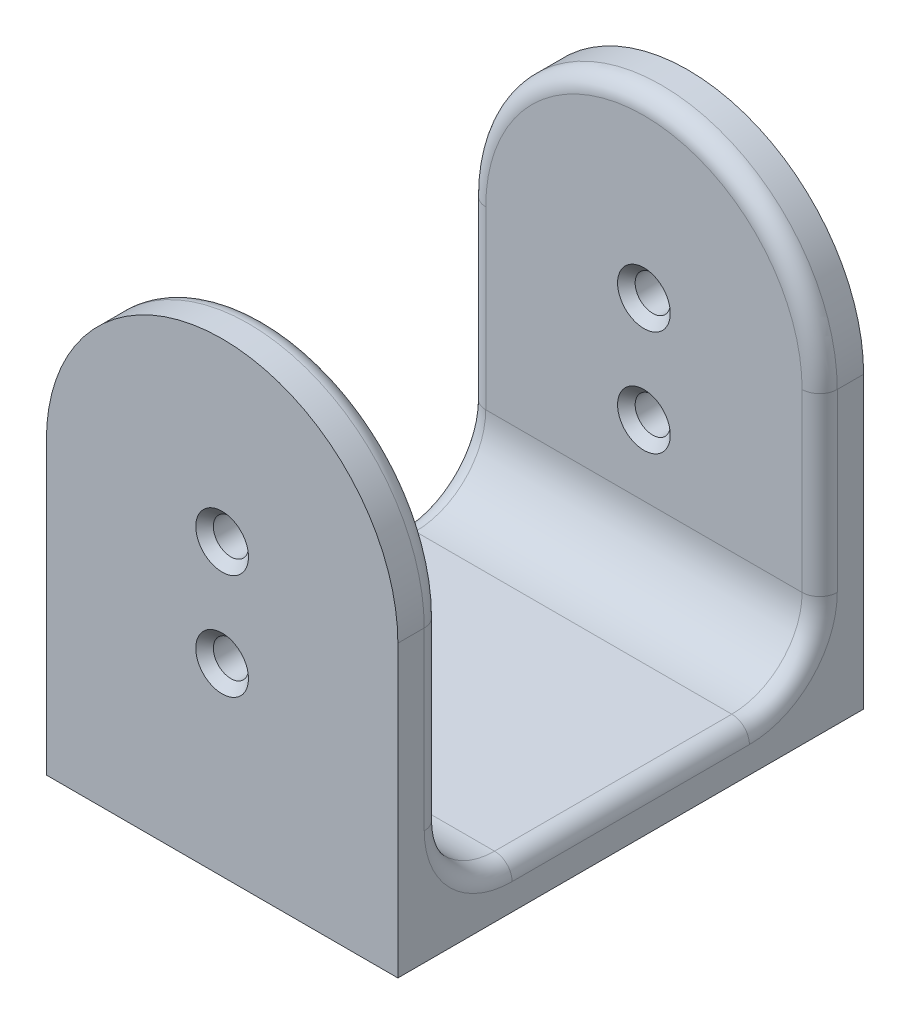
ISO-10303-21;
HEADER;
FILE_DESCRIPTION(('STEP AP214'),'2;1');
FILE_NAME('part.step','',(''),(''),'','','');
FILE_SCHEMA(('AUTOMOTIVE_DESIGN { 1 0 10303 214 1 1 1 1 }'));
ENDSEC;
DATA;
#1=APPLICATION_CONTEXT('core data for automotive mechanical design processes');
#2=APPLICATION_PROTOCOL_DEFINITION('international standard','automotive_design',2000,#1);
#3=PRODUCT_CONTEXT('',#1,'mechanical');
#4=PRODUCT('Part','Part','',(#3));
#5=PRODUCT_RELATED_PRODUCT_CATEGORY('part','',(#4));
#6=PRODUCT_DEFINITION_FORMATION('','',#4);
#7=PRODUCT_DEFINITION_CONTEXT('part definition',#1,'design');
#8=PRODUCT_DEFINITION('design','',#6,#7);
#9=PRODUCT_DEFINITION_SHAPE('','',#8);
#10=(LENGTH_UNIT() NAMED_UNIT(*) SI_UNIT(.MILLI.,.METRE.));
#11=(NAMED_UNIT(*) PLANE_ANGLE_UNIT() SI_UNIT($,.RADIAN.));
#12=(NAMED_UNIT(*) SI_UNIT($,.STERADIAN.) SOLID_ANGLE_UNIT());
#13=UNCERTAINTY_MEASURE_WITH_UNIT(LENGTH_MEASURE(1.E-05),#10,'distance_accuracy_value','');
#14=(GEOMETRIC_REPRESENTATION_CONTEXT(3) GLOBAL_UNCERTAINTY_ASSIGNED_CONTEXT((#13)) GLOBAL_UNIT_ASSIGNED_CONTEXT((#10,
#11,#12)) REPRESENTATION_CONTEXT('',''));
#15=CARTESIAN_POINT('',(0.,0.,0.));
#16=DIRECTION('',(0.,0.,1.));
#17=DIRECTION('',(1.,0.,0.));
#18=AXIS2_PLACEMENT_3D('',#15,#16,#17);
#19=CARTESIAN_POINT('',(0.,5.,-50.5));
#20=DIRECTION('',(0.,-1.,0.));
#21=DIRECTION('',(1.,0.,0.));
#22=AXIS2_PLACEMENT_3D('',#19,#20,#21);
#23=PLANE('',#22);
#24=DIRECTION('',(-1.,0.,0.));
#25=VECTOR('',#24,1.);
#26=CARTESIAN_POINT('',(-20.,5.,-37.5));
#27=LINE('',#26,#25);
#28=CARTESIAN_POINT('',(18.,5.,-37.5));
#29=VERTEX_POINT('',#28);
#30=CARTESIAN_POINT('',(-18.,5.,-37.5));
#31=VERTEX_POINT('',#30);
#32=EDGE_CURVE('E233',#29,#31,#27,.T.);
#33=ORIENTED_EDGE('',*,*,#32,.T.);
#34=DIRECTION('',(0.,0.,1.));
#35=VECTOR('',#34,1.);
#36=CARTESIAN_POINT('',(-18.,5.,-50.5));
#37=LINE('',#36,#35);
#38=CARTESIAN_POINT('',(-18.,5.,-10.5));
#39=VERTEX_POINT('',#38);
#40=EDGE_CURVE('E312',#31,#39,#37,.T.);
#41=ORIENTED_EDGE('',*,*,#40,.T.);
#42=DIRECTION('',(-1.,0.,0.));
#43=VECTOR('',#42,1.);
#44=CARTESIAN_POINT('',(0.,5.,-10.5));
#45=LINE('',#44,#43);
#46=CARTESIAN_POINT('',(18.,5.,-10.5));
#47=VERTEX_POINT('',#46);
#48=EDGE_CURVE('E229',#39,#47,#45,.F.);
#49=ORIENTED_EDGE('',*,*,#48,.T.);
#50=DIRECTION('',(0.,0.,1.));
#51=VECTOR('',#50,1.);
#52=CARTESIAN_POINT('',(18.,5.,-50.5));
#53=LINE('',#52,#51);
#54=EDGE_CURVE('E309',#47,#29,#53,.F.);
#55=ORIENTED_EDGE('',*,*,#54,.T.);
#56=EDGE_LOOP('',(#33,#41,#49,#55));
#57=FACE_BOUND('',#56,.T.);
#58=ADVANCED_FACE('F45',(#57),#23,.F.);
#59=CARTESIAN_POINT('',(0.,33.,-2.5));
#60=DIRECTION('',(0.,0.,-1.));
#61=DIRECTION('',(-1.,0.,0.));
#62=AXIS2_PLACEMENT_3D('',#59,#60,#61);
#63=PLANE('',#62);
#64=CARTESIAN_POINT('',(0.,21.,-2.5));
#65=DIRECTION('',(0.,0.,-1.));
#66=DIRECTION('',(-1.,0.,0.));
#67=AXIS2_PLACEMENT_3D('',#64,#65,#66);
#68=CIRCLE('',#67,3.00000000000001);
#69=CARTESIAN_POINT('',(-3.00000000000001,21.,-2.5));
#70=VERTEX_POINT('',#69);
#71=EDGE_CURVE('E360',#70,#70,#68,.F.);
#72=ORIENTED_EDGE('',*,*,#71,.T.);
#73=EDGE_LOOP('',(#72));
#74=FACE_BOUND('',#73,.T.);
#75=CARTESIAN_POINT('',(0.,33.,-2.5));
#76=DIRECTION('',(0.,0.,-1.));
#77=DIRECTION('',(-1.,0.,0.));
#78=AXIS2_PLACEMENT_3D('',#75,#76,#77);
#79=CIRCLE('',#78,3.00000000000001);
#80=CARTESIAN_POINT('',(-3.00000000000001,33.,-2.5));
#81=VERTEX_POINT('',#80);
#82=EDGE_CURVE('E315',#81,#81,#79,.F.);
#83=ORIENTED_EDGE('',*,*,#82,.T.);
#84=EDGE_LOOP('',(#83));
#85=FACE_BOUND('',#84,.T.);
#86=CARTESIAN_POINT('',(0.,33.,-2.5));
#87=DIRECTION('',(0.,0.,-1.));
#88=DIRECTION('',(-1.,0.,0.));
#89=AXIS2_PLACEMENT_3D('',#86,#87,#88);
#90=CIRCLE('',#89,18.);
#91=CARTESIAN_POINT('',(-18.,33.,-2.5));
#92=VERTEX_POINT('',#91);
#93=CARTESIAN_POINT('',(18.,33.,-2.5));
#94=VERTEX_POINT('',#93);
#95=EDGE_CURVE('E62',#92,#94,#90,.T.);
#96=ORIENTED_EDGE('',*,*,#95,.T.);
#97=DIRECTION('',(0.,1.,0.));
#98=VECTOR('',#97,1.);
#99=CARTESIAN_POINT('',(18.,13.,-2.5));
#100=LINE('',#99,#98);
#101=CARTESIAN_POINT('',(18.,13.,-2.5));
#102=VERTEX_POINT('',#101);
#103=EDGE_CURVE('E304',#94,#102,#100,.F.);
#104=ORIENTED_EDGE('',*,*,#103,.T.);
#105=DIRECTION('',(-1.,0.,0.));
#106=VECTOR('',#105,1.);
#107=CARTESIAN_POINT('',(0.,13.,-2.5));
#108=LINE('',#107,#106);
#109=CARTESIAN_POINT('',(-18.,13.,-2.5));
#110=VERTEX_POINT('',#109);
#111=EDGE_CURVE('E241',#102,#110,#108,.T.);
#112=ORIENTED_EDGE('',*,*,#111,.T.);
#113=DIRECTION('',(0.,-1.,0.));
#114=VECTOR('',#113,1.);
#115=CARTESIAN_POINT('',(-18.,33.,-2.5));
#116=LINE('',#115,#114);
#117=EDGE_CURVE('E67',#110,#92,#116,.F.);
#118=ORIENTED_EDGE('',*,*,#117,.T.);
#119=EDGE_LOOP('',(#96,#104,#112,#118));
#120=FACE_BOUND('',#119,.T.);
#121=ADVANCED_FACE('F476',(#74,#85,#120),#63,.T.);
#122=CARTESIAN_POINT('',(0.,33.,2.5));
#123=DIRECTION('',(0.,0.,-1.));
#124=DIRECTION('',(-1.,0.,0.));
#125=AXIS2_PLACEMENT_3D('',#122,#123,#124);
#126=PLANE('',#125);
#127=CARTESIAN_POINT('',(0.,21.,2.5));
#128=DIRECTION('',(0.,0.,-1.));
#129=DIRECTION('',(-1.,0.,0.));
#130=AXIS2_PLACEMENT_3D('',#127,#128,#129);
#131=CIRCLE('',#130,3.);
#132=CARTESIAN_POINT('',(-3.,21.,2.5));
#133=VERTEX_POINT('',#132);
#134=EDGE_CURVE('E376',#133,#133,#131,.T.);
#135=ORIENTED_EDGE('',*,*,#134,.T.);
#136=EDGE_LOOP('',(#135));
#137=FACE_BOUND('',#136,.T.);
#138=CARTESIAN_POINT('',(0.,33.,2.5));
#139=DIRECTION('',(0.,0.,-1.));
#140=DIRECTION('',(-1.,0.,0.));
#141=AXIS2_PLACEMENT_3D('',#138,#139,#140);
#142=CIRCLE('',#141,3.);
#143=CARTESIAN_POINT('',(-3.,33.,2.5));
#144=VERTEX_POINT('',#143);
#145=EDGE_CURVE('E372',#144,#144,#142,.T.);
#146=ORIENTED_EDGE('',*,*,#145,.T.);
#147=EDGE_LOOP('',(#146));
#148=FACE_BOUND('',#147,.T.);
#149=DIRECTION('',(0.,1.,0.));
#150=VECTOR('',#149,1.);
#151=CARTESIAN_POINT('',(20.,0.,2.5));
#152=LINE('',#151,#150);
#153=CARTESIAN_POINT('',(20.,0.,2.5));
#154=VERTEX_POINT('',#153);
#155=CARTESIAN_POINT('',(20.,33.,2.5));
#156=VERTEX_POINT('',#155);
#157=EDGE_CURVE('E213',#154,#156,#152,.T.);
#158=ORIENTED_EDGE('',*,*,#157,.T.);
#159=CARTESIAN_POINT('',(0.,33.,2.5));
#160=DIRECTION('',(0.,0.,1.));
#161=DIRECTION('',(-1.,0.,0.));
#162=AXIS2_PLACEMENT_3D('',#159,#160,#161);
#163=CIRCLE('',#162,20.);
#164=CARTESIAN_POINT('',(-20.,33.,2.5));
#165=VERTEX_POINT('',#164);
#166=EDGE_CURVE('E203',#156,#165,#163,.T.);
#167=ORIENTED_EDGE('',*,*,#166,.T.);
#168=DIRECTION('',(0.,-1.,0.));
#169=VECTOR('',#168,1.);
#170=CARTESIAN_POINT('',(-20.,0.,2.5));
#171=LINE('',#170,#169);
#172=CARTESIAN_POINT('',(-20.,0.,2.5));
#173=VERTEX_POINT('',#172);
#174=EDGE_CURVE('E207',#165,#173,#171,.T.);
#175=ORIENTED_EDGE('',*,*,#174,.T.);
#176=DIRECTION('',(1.,0.,0.));
#177=VECTOR('',#176,1.);
#178=CARTESIAN_POINT('',(-20.,0.,2.5));
#179=LINE('',#178,#177);
#180=EDGE_CURVE('E210',#173,#154,#179,.T.);
#181=ORIENTED_EDGE('',*,*,#180,.T.);
#182=EDGE_LOOP('',(#158,#167,#175,#181));
#183=FACE_BOUND('',#182,.T.);
#184=ADVANCED_FACE('F478',(#137,#148,#183),#126,.F.);
#185=CARTESIAN_POINT('',(0.,33.,2.5));
#186=DIRECTION('',(0.,0.,-1.));
#187=DIRECTION('',(-1.,0.,0.));
#188=AXIS2_PLACEMENT_3D('',#185,#186,#187);
#189=CYLINDRICAL_SURFACE('',#188,20.);
#190=DIRECTION('',(0.,0.,-1.));
#191=VECTOR('',#190,1.);
#192=CARTESIAN_POINT('',(20.,33.,2.5));
#193=LINE('',#192,#191);
#194=CARTESIAN_POINT('',(20.,33.,-0.5));
#195=VERTEX_POINT('',#194);
#196=EDGE_CURVE('E216',#156,#195,#193,.T.);
#197=ORIENTED_EDGE('',*,*,#196,.T.);
#198=CARTESIAN_POINT('',(0.,33.,-0.5));
#199=DIRECTION('',(0.,0.,-1.));
#200=DIRECTION('',(-1.,0.,0.));
#201=AXIS2_PLACEMENT_3D('',#198,#199,#200);
#202=CIRCLE('',#201,20.);
#203=CARTESIAN_POINT('',(-20.,33.,-0.5));
#204=VERTEX_POINT('',#203);
#205=EDGE_CURVE('E297',#195,#204,#202,.F.);
#206=ORIENTED_EDGE('',*,*,#205,.T.);
#207=DIRECTION('',(0.,0.,-1.));
#208=VECTOR('',#207,1.);
#209=CARTESIAN_POINT('',(-20.,33.,2.5));
#210=LINE('',#209,#208);
#211=EDGE_CURVE('E225',#165,#204,#210,.T.);
#212=ORIENTED_EDGE('',*,*,#211,.F.);
#213=ORIENTED_EDGE('',*,*,#166,.F.);
#214=EDGE_LOOP('',(#197,#206,#212,#213));
#215=FACE_BOUND('',#214,.T.);
#216=ADVANCED_FACE('F485',(#215),#189,.T.);
#217=CARTESIAN_POINT('',(-20.,0.,2.5));
#218=DIRECTION('',(1.,0.,0.));
#219=DIRECTION('',(0.,0.,-1.));
#220=AXIS2_PLACEMENT_3D('',#217,#218,#219);
#221=PLANE('',#220);
#222=ORIENTED_EDGE('',*,*,#211,.T.);
#223=DIRECTION('',(0.,-1.,0.));
#224=VECTOR('',#223,1.);
#225=CARTESIAN_POINT('',(-20.,13.,-0.5));
#226=LINE('',#225,#224);
#227=CARTESIAN_POINT('',(-20.,13.,-0.5));
#228=VERTEX_POINT('',#227);
#229=EDGE_CURVE('E288',#204,#228,#226,.T.);
#230=ORIENTED_EDGE('',*,*,#229,.T.);
#231=CARTESIAN_POINT('',(-20.,13.,-10.5));
#232=DIRECTION('',(1.,0.,0.));
#233=DIRECTION('',(0.,0.,-1.));
#234=AXIS2_PLACEMENT_3D('',#231,#232,#233);
#235=CIRCLE('',#234,10.);
#236=CARTESIAN_POINT('',(-20.,3.,-10.5));
#237=VERTEX_POINT('',#236);
#238=EDGE_CURVE('E279',#228,#237,#235,.T.);
#239=ORIENTED_EDGE('',*,*,#238,.T.);
#240=DIRECTION('',(0.,0.,1.));
#241=VECTOR('',#240,1.);
#242=CARTESIAN_POINT('',(-20.,3.,2.5));
#243=LINE('',#242,#241);
#244=CARTESIAN_POINT('',(-20.,3.,-37.5));
#245=VERTEX_POINT('',#244);
#246=EDGE_CURVE('E276',#237,#245,#243,.F.);
#247=ORIENTED_EDGE('',*,*,#246,.T.);
#248=CARTESIAN_POINT('',(-20.,13.,-37.5));
#249=DIRECTION('',(1.,0.,0.));
#250=DIRECTION('',(0.,0.,-1.));
#251=AXIS2_PLACEMENT_3D('',#248,#249,#250);
#252=CIRCLE('',#251,10.);
#253=CARTESIAN_POINT('',(-20.,13.,-47.5));
#254=VERTEX_POINT('',#253);
#255=EDGE_CURVE('E282',#245,#254,#252,.T.);
#256=ORIENTED_EDGE('',*,*,#255,.T.);
#257=DIRECTION('',(0.,1.,0.));
#258=VECTOR('',#257,1.);
#259=CARTESIAN_POINT('',(-20.,0.,-47.5));
#260=LINE('',#259,#258);
#261=CARTESIAN_POINT('',(-20.,33.,-47.5));
#262=VERTEX_POINT('',#261);
#263=EDGE_CURVE('E285',#254,#262,#260,.T.);
#264=ORIENTED_EDGE('',*,*,#263,.T.);
#265=DIRECTION('',(0.,0.,-1.));
#266=VECTOR('',#265,1.);
#267=CARTESIAN_POINT('',(-20.,33.,-45.5));
#268=LINE('',#267,#266);
#269=CARTESIAN_POINT('',(-20.,33.,-50.5));
#270=VERTEX_POINT('',#269);
#271=EDGE_CURVE('E171',#262,#270,#268,.T.);
#272=ORIENTED_EDGE('',*,*,#271,.T.);
#273=DIRECTION('',(0.,1.,0.));
#274=VECTOR('',#273,1.);
#275=CARTESIAN_POINT('',(-20.,33.,-50.5));
#276=LINE('',#275,#274);
#277=CARTESIAN_POINT('',(-20.,0.,-50.5));
#278=VERTEX_POINT('',#277);
#279=EDGE_CURVE('E188',#278,#270,#276,.T.);
#280=ORIENTED_EDGE('',*,*,#279,.F.);
#281=DIRECTION('',(0.,0.,-1.));
#282=VECTOR('',#281,1.);
#283=CARTESIAN_POINT('',(-20.,0.,2.5));
#284=LINE('',#283,#282);
#285=EDGE_CURVE('E222',#173,#278,#284,.T.);
#286=ORIENTED_EDGE('',*,*,#285,.F.);
#287=ORIENTED_EDGE('',*,*,#174,.F.);
#288=EDGE_LOOP('',(#222,#230,#239,#247,#256,#264,#272,#280,#286,#287));
#289=FACE_BOUND('',#288,.T.);
#290=ADVANCED_FACE('F447',(#289),#221,.F.);
#291=CARTESIAN_POINT('',(-20.,0.,2.5));
#292=DIRECTION('',(0.,1.,0.));
#293=DIRECTION('',(-1.,0.,0.));
#294=AXIS2_PLACEMENT_3D('',#291,#292,#293);
#295=PLANE('',#294);
#296=ORIENTED_EDGE('',*,*,#285,.T.);
#297=DIRECTION('',(-1.,0.,0.));
#298=VECTOR('',#297,1.);
#299=CARTESIAN_POINT('',(0.,0.,-50.5));
#300=LINE('',#299,#298);
#301=CARTESIAN_POINT('',(20.,0.,-50.5));
#302=VERTEX_POINT('',#301);
#303=EDGE_CURVE('E183',#302,#278,#300,.T.);
#304=ORIENTED_EDGE('',*,*,#303,.F.);
#305=DIRECTION('',(0.,0.,-1.));
#306=VECTOR('',#305,1.);
#307=CARTESIAN_POINT('',(20.,0.,2.5));
#308=LINE('',#307,#306);
#309=EDGE_CURVE('E178',#154,#302,#308,.T.);
#310=ORIENTED_EDGE('',*,*,#309,.F.);
#311=ORIENTED_EDGE('',*,*,#180,.F.);
#312=EDGE_LOOP('',(#296,#304,#310,#311));
#313=FACE_BOUND('',#312,.T.);
#314=ADVANCED_FACE('F495',(#313),#295,.F.);
#315=CARTESIAN_POINT('',(20.,0.,2.5));
#316=DIRECTION('',(-1.,0.,0.));
#317=DIRECTION('',(0.,-1.,0.));
#318=AXIS2_PLACEMENT_3D('',#315,#316,#317);
#319=PLANE('',#318);
#320=DIRECTION('',(0.,0.,-1.));
#321=VECTOR('',#320,1.);
#322=CARTESIAN_POINT('',(20.,33.,-45.5));
#323=LINE('',#322,#321);
#324=CARTESIAN_POINT('',(20.,33.,-47.5));
#325=VERTEX_POINT('',#324);
#326=CARTESIAN_POINT('',(20.,33.,-50.5));
#327=VERTEX_POINT('',#326);
#328=EDGE_CURVE('E160',#325,#327,#323,.T.);
#329=ORIENTED_EDGE('',*,*,#328,.F.);
#330=DIRECTION('',(0.,-1.,0.));
#331=VECTOR('',#330,1.);
#332=CARTESIAN_POINT('',(20.,0.,-47.5));
#333=LINE('',#332,#331);
#334=CARTESIAN_POINT('',(20.,13.,-47.5));
#335=VERTEX_POINT('',#334);
#336=EDGE_CURVE('E257',#325,#335,#333,.T.);
#337=ORIENTED_EDGE('',*,*,#336,.T.);
#338=CARTESIAN_POINT('',(20.,13.,-37.5));
#339=DIRECTION('',(-1.,0.,0.));
#340=DIRECTION('',(0.,-1.,0.));
#341=AXIS2_PLACEMENT_3D('',#338,#339,#340);
#342=CIRCLE('',#341,10.);
#343=CARTESIAN_POINT('',(20.,3.,-37.5));
#344=VERTEX_POINT('',#343);
#345=EDGE_CURVE('E253',#335,#344,#342,.T.);
#346=ORIENTED_EDGE('',*,*,#345,.T.);
#347=DIRECTION('',(0.,0.,1.));
#348=VECTOR('',#347,1.);
#349=CARTESIAN_POINT('',(20.,3.,2.5));
#350=LINE('',#349,#348);
#351=CARTESIAN_POINT('',(20.,3.,-10.5));
#352=VERTEX_POINT('',#351);
#353=EDGE_CURVE('E244',#344,#352,#350,.T.);
#354=ORIENTED_EDGE('',*,*,#353,.T.);
#355=CARTESIAN_POINT('',(20.,13.,-10.5));
#356=DIRECTION('',(-1.,0.,0.));
#357=DIRECTION('',(0.,-1.,0.));
#358=AXIS2_PLACEMENT_3D('',#355,#356,#357);
#359=CIRCLE('',#358,10.);
#360=CARTESIAN_POINT('',(20.,13.,-0.5));
#361=VERTEX_POINT('',#360);
#362=EDGE_CURVE('E247',#352,#361,#359,.T.);
#363=ORIENTED_EDGE('',*,*,#362,.T.);
#364=DIRECTION('',(0.,1.,0.));
#365=VECTOR('',#364,1.);
#366=CARTESIAN_POINT('',(20.,33.,-0.5));
#367=LINE('',#366,#365);
#368=EDGE_CURVE('E250',#361,#195,#367,.T.);
#369=ORIENTED_EDGE('',*,*,#368,.T.);
#370=ORIENTED_EDGE('',*,*,#196,.F.);
#371=ORIENTED_EDGE('',*,*,#157,.F.);
#372=ORIENTED_EDGE('',*,*,#309,.T.);
#373=DIRECTION('',(0.,-1.,0.));
#374=VECTOR('',#373,1.);
#375=CARTESIAN_POINT('',(20.,33.,-50.5));
#376=LINE('',#375,#374);
#377=EDGE_CURVE('E174',#327,#302,#376,.T.);
#378=ORIENTED_EDGE('',*,*,#377,.F.);
#379=EDGE_LOOP('',(#329,#337,#346,#354,#363,#369,#370,#371,#372,#378));
#380=FACE_BOUND('',#379,.T.);
#381=ADVANCED_FACE('F175',(#380),#319,.F.);
#382=CARTESIAN_POINT('',(0.,33.,2.5));
#383=DIRECTION('',(0.,0.,-1.));
#384=DIRECTION('',(-1.,0.,0.));
#385=AXIS2_PLACEMENT_3D('',#382,#383,#384);
#386=CYLINDRICAL_SURFACE('',#385,2.);
#387=CARTESIAN_POINT('',(0.,33.,-1.49999999999998));
#388=DIRECTION('',(0.,0.,-1.));
#389=DIRECTION('',(-1.,0.,0.));
#390=AXIS2_PLACEMENT_3D('',#387,#388,#389);
#391=CIRCLE('',#390,2.);
#392=CARTESIAN_POINT('',(-2.,33.,-1.49999999999998));
#393=VERTEX_POINT('',#392);
#394=EDGE_CURVE('E384',#393,#393,#391,.T.);
#395=ORIENTED_EDGE('',*,*,#394,.T.);
#396=EDGE_LOOP('',(#395));
#397=FACE_BOUND('',#396,.T.);
#398=CARTESIAN_POINT('',(0.,33.,1.50000000000001));
#399=DIRECTION('',(0.,0.,-1.));
#400=DIRECTION('',(-1.,0.,0.));
#401=AXIS2_PLACEMENT_3D('',#398,#399,#400);
#402=CIRCLE('',#401,2.);
#403=CARTESIAN_POINT('',(-2.,33.,1.50000000000001));
#404=VERTEX_POINT('',#403);
#405=EDGE_CURVE('E380',#404,#404,#402,.F.);
#406=ORIENTED_EDGE('',*,*,#405,.T.);
#407=EDGE_LOOP('',(#406));
#408=FACE_BOUND('',#407,.T.);
#409=ADVANCED_FACE('F494',(#397,#408),#386,.F.);
#410=CARTESIAN_POINT('',(0.,21.,2.5));
#411=DIRECTION('',(0.,0.,-1.));
#412=DIRECTION('',(-1.,0.,0.));
#413=AXIS2_PLACEMENT_3D('',#410,#411,#412);
#414=CYLINDRICAL_SURFACE('',#413,2.);
#415=CARTESIAN_POINT('',(0.,21.,-1.49999999999998));
#416=DIRECTION('',(0.,0.,-1.));
#417=DIRECTION('',(-1.,0.,0.));
#418=AXIS2_PLACEMENT_3D('',#415,#416,#417);
#419=CIRCLE('',#418,2.);
#420=CARTESIAN_POINT('',(-2.,21.,-1.49999999999998));
#421=VERTEX_POINT('',#420);
#422=EDGE_CURVE('E368',#421,#421,#419,.T.);
#423=ORIENTED_EDGE('',*,*,#422,.T.);
#424=EDGE_LOOP('',(#423));
#425=FACE_BOUND('',#424,.T.);
#426=CARTESIAN_POINT('',(0.,21.,1.50000000000001));
#427=DIRECTION('',(0.,0.,-1.));
#428=DIRECTION('',(-1.,0.,0.));
#429=AXIS2_PLACEMENT_3D('',#426,#427,#428);
#430=CIRCLE('',#429,2.);
#431=CARTESIAN_POINT('',(-2.,21.,1.50000000000001));
#432=VERTEX_POINT('',#431);
#433=EDGE_CURVE('E364',#432,#432,#430,.F.);
#434=ORIENTED_EDGE('',*,*,#433,.T.);
#435=EDGE_LOOP('',(#434));
#436=FACE_BOUND('',#435,.T.);
#437=ADVANCED_FACE('F605',(#425,#436),#414,.F.);
#438=CARTESIAN_POINT('',(0.,0.,-50.5));
#439=DIRECTION('',(0.,0.,-1.));
#440=DIRECTION('',(-1.,0.,0.));
#441=AXIS2_PLACEMENT_3D('',#438,#439,#440);
#442=PLANE('',#441);
#443=CARTESIAN_POINT('',(0.,21.,-50.5));
#444=DIRECTION('',(0.,0.,-1.));
#445=DIRECTION('',(-1.,0.,0.));
#446=AXIS2_PLACEMENT_3D('',#443,#444,#445);
#447=CIRCLE('',#446,3.);
#448=CARTESIAN_POINT('',(-3.,21.,-50.5));
#449=VERTEX_POINT('',#448);
#450=EDGE_CURVE('E400',#449,#449,#447,.F.);
#451=ORIENTED_EDGE('',*,*,#450,.T.);
#452=EDGE_LOOP('',(#451));
#453=FACE_BOUND('',#452,.T.);
#454=CARTESIAN_POINT('',(0.,33.,-50.5));
#455=DIRECTION('',(0.,0.,-1.));
#456=DIRECTION('',(-1.,0.,0.));
#457=AXIS2_PLACEMENT_3D('',#454,#455,#456);
#458=CIRCLE('',#457,3.);
#459=CARTESIAN_POINT('',(-3.,33.,-50.5));
#460=VERTEX_POINT('',#459);
#461=EDGE_CURVE('E396',#460,#460,#458,.F.);
#462=ORIENTED_EDGE('',*,*,#461,.T.);
#463=EDGE_LOOP('',(#462));
#464=FACE_BOUND('',#463,.T.);
#465=ORIENTED_EDGE('',*,*,#279,.T.);
#466=CARTESIAN_POINT('',(0.,33.,-50.5));
#467=DIRECTION('',(0.,0.,-1.));
#468=DIRECTION('',(-1.,0.,0.));
#469=AXIS2_PLACEMENT_3D('',#466,#467,#468);
#470=CIRCLE('',#469,20.);
#471=EDGE_CURVE('E165',#270,#327,#470,.T.);
#472=ORIENTED_EDGE('',*,*,#471,.T.);
#473=ORIENTED_EDGE('',*,*,#377,.T.);
#474=ORIENTED_EDGE('',*,*,#303,.T.);
#475=EDGE_LOOP('',(#465,#472,#473,#474));
#476=FACE_BOUND('',#475,.T.);
#477=ADVANCED_FACE('F186',(#453,#464,#476),#442,.T.);
#478=CARTESIAN_POINT('',(0.,33.,-45.5));
#479=DIRECTION('',(0.,0.,-1.));
#480=DIRECTION('',(-1.,0.,0.));
#481=AXIS2_PLACEMENT_3D('',#478,#479,#480);
#482=CYLINDRICAL_SURFACE('',#481,20.);
#483=ORIENTED_EDGE('',*,*,#271,.F.);
#484=CARTESIAN_POINT('',(0.,33.,-47.5));
#485=DIRECTION('',(0.,0.,-1.));
#486=DIRECTION('',(-1.,0.,0.));
#487=AXIS2_PLACEMENT_3D('',#484,#485,#486);
#488=CIRCLE('',#487,20.);
#489=EDGE_CURVE('E167',#262,#325,#488,.T.);
#490=ORIENTED_EDGE('',*,*,#489,.T.);
#491=ORIENTED_EDGE('',*,*,#328,.T.);
#492=ORIENTED_EDGE('',*,*,#471,.F.);
#493=EDGE_LOOP('',(#483,#490,#491,#492));
#494=FACE_BOUND('',#493,.T.);
#495=ADVANCED_FACE('F163',(#494),#482,.T.);
#496=CARTESIAN_POINT('',(0.,33.,-45.5));
#497=DIRECTION('',(0.,0.,-1.));
#498=DIRECTION('',(-1.,0.,0.));
#499=AXIS2_PLACEMENT_3D('',#496,#497,#498);
#500=PLANE('',#499);
#501=CARTESIAN_POINT('',(0.,21.,-45.5));
#502=DIRECTION('',(0.,0.,-1.));
#503=DIRECTION('',(-1.,0.,0.));
#504=AXIS2_PLACEMENT_3D('',#501,#502,#503);
#505=CIRCLE('',#504,2.99999999999999);
#506=CARTESIAN_POINT('',(-2.99999999999999,21.,-45.5));
#507=VERTEX_POINT('',#506);
#508=EDGE_CURVE('E408',#507,#507,#505,.T.);
#509=ORIENTED_EDGE('',*,*,#508,.T.);
#510=EDGE_LOOP('',(#509));
#511=FACE_BOUND('',#510,.T.);
#512=CARTESIAN_POINT('',(0.,33.,-45.5));
#513=DIRECTION('',(0.,0.,-1.));
#514=DIRECTION('',(-1.,0.,0.));
#515=AXIS2_PLACEMENT_3D('',#512,#513,#514);
#516=CIRCLE('',#515,2.99999999999999);
#517=CARTESIAN_POINT('',(-2.99999999999999,33.,-45.5));
#518=VERTEX_POINT('',#517);
#519=EDGE_CURVE('E404',#518,#518,#516,.T.);
#520=ORIENTED_EDGE('',*,*,#519,.T.);
#521=EDGE_LOOP('',(#520));
#522=FACE_BOUND('',#521,.T.);
#523=DIRECTION('',(-1.,0.,0.));
#524=VECTOR('',#523,1.);
#525=CARTESIAN_POINT('',(20.,13.,-45.5));
#526=LINE('',#525,#524);
#527=CARTESIAN_POINT('',(-18.,13.,-45.5));
#528=VERTEX_POINT('',#527);
#529=CARTESIAN_POINT('',(18.,13.,-45.5));
#530=VERTEX_POINT('',#529);
#531=EDGE_CURVE('E237',#528,#530,#526,.F.);
#532=ORIENTED_EDGE('',*,*,#531,.T.);
#533=DIRECTION('',(0.,-1.,0.));
#534=VECTOR('',#533,1.);
#535=CARTESIAN_POINT('',(18.,33.,-45.5));
#536=LINE('',#535,#534);
#537=CARTESIAN_POINT('',(18.,33.,-45.5));
#538=VERTEX_POINT('',#537);
#539=EDGE_CURVE('E273',#530,#538,#536,.F.);
#540=ORIENTED_EDGE('',*,*,#539,.T.);
#541=CARTESIAN_POINT('',(0.,33.,-45.5));
#542=DIRECTION('',(0.,0.,-1.));
#543=DIRECTION('',(-1.,0.,0.));
#544=AXIS2_PLACEMENT_3D('',#541,#542,#543);
#545=CIRCLE('',#544,18.);
#546=CARTESIAN_POINT('',(-18.,33.,-45.5));
#547=VERTEX_POINT('',#546);
#548=EDGE_CURVE('E267',#538,#547,#545,.F.);
#549=ORIENTED_EDGE('',*,*,#548,.T.);
#550=DIRECTION('',(0.,1.,0.));
#551=VECTOR('',#550,1.);
#552=CARTESIAN_POINT('',(-18.,33.,-45.5));
#553=LINE('',#552,#551);
#554=EDGE_CURVE('E270',#547,#528,#553,.F.);
#555=ORIENTED_EDGE('',*,*,#554,.T.);
#556=EDGE_LOOP('',(#532,#540,#549,#555));
#557=FACE_BOUND('',#556,.T.);
#558=ADVANCED_FACE('F422',(#511,#522,#557),#500,.F.);
#559=CARTESIAN_POINT('',(0.,21.,-45.5));
#560=DIRECTION('',(0.,0.,-1.));
#561=DIRECTION('',(-1.,0.,0.));
#562=AXIS2_PLACEMENT_3D('',#559,#560,#561);
#563=CYLINDRICAL_SURFACE('',#562,2.);
#564=CARTESIAN_POINT('',(0.,21.,-49.5));
#565=DIRECTION('',(0.,0.,-1.));
#566=DIRECTION('',(-1.,0.,0.));
#567=AXIS2_PLACEMENT_3D('',#564,#565,#566);
#568=CIRCLE('',#567,2.);
#569=CARTESIAN_POINT('',(-2.,21.,-49.5));
#570=VERTEX_POINT('',#569);
#571=EDGE_CURVE('E392',#570,#570,#568,.T.);
#572=ORIENTED_EDGE('',*,*,#571,.T.);
#573=EDGE_LOOP('',(#572));
#574=FACE_BOUND('',#573,.T.);
#575=CARTESIAN_POINT('',(0.,21.,-46.5));
#576=DIRECTION('',(0.,0.,-1.));
#577=DIRECTION('',(-1.,0.,0.));
#578=AXIS2_PLACEMENT_3D('',#575,#576,#577);
#579=CIRCLE('',#578,2.);
#580=CARTESIAN_POINT('',(-2.,21.,-46.5));
#581=VERTEX_POINT('',#580);
#582=EDGE_CURVE('E388',#581,#581,#579,.F.);
#583=ORIENTED_EDGE('',*,*,#582,.T.);
#584=EDGE_LOOP('',(#583));
#585=FACE_BOUND('',#584,.T.);
#586=ADVANCED_FACE('F425',(#574,#585),#563,.F.);
#587=CARTESIAN_POINT('',(0.,33.,-45.5));
#588=DIRECTION('',(0.,0.,-1.));
#589=DIRECTION('',(-1.,0.,0.));
#590=AXIS2_PLACEMENT_3D('',#587,#588,#589);
#591=CYLINDRICAL_SURFACE('',#590,2.);
#592=CARTESIAN_POINT('',(0.,33.,-49.5));
#593=DIRECTION('',(0.,0.,-1.));
#594=DIRECTION('',(-1.,0.,0.));
#595=AXIS2_PLACEMENT_3D('',#592,#593,#594);
#596=CIRCLE('',#595,2.);
#597=CARTESIAN_POINT('',(-2.,33.,-49.5));
#598=VERTEX_POINT('',#597);
#599=EDGE_CURVE('E11',#598,#598,#596,.T.);
#600=ORIENTED_EDGE('',*,*,#599,.T.);
#601=EDGE_LOOP('',(#600));
#602=FACE_BOUND('',#601,.T.);
#603=CARTESIAN_POINT('',(0.,33.,-46.5));
#604=DIRECTION('',(0.,0.,-1.));
#605=DIRECTION('',(-1.,0.,0.));
#606=AXIS2_PLACEMENT_3D('',#603,#604,#605);
#607=CIRCLE('',#606,2.);
#608=CARTESIAN_POINT('',(-2.,33.,-46.5));
#609=VERTEX_POINT('',#608);
#610=EDGE_CURVE('E55',#609,#609,#607,.F.);
#611=ORIENTED_EDGE('',*,*,#610,.T.);
#612=EDGE_LOOP('',(#611));
#613=FACE_BOUND('',#612,.T.);
#614=ADVANCED_FACE('F415',(#602,#613),#591,.F.);
#615=CARTESIAN_POINT('',(0.,13.,-37.5));
#616=DIRECTION('',(1.,0.,0.));
#617=DIRECTION('',(0.,1.,0.));
#618=AXIS2_PLACEMENT_3D('',#615,#616,#617);
#619=CYLINDRICAL_SURFACE('',#618,8.);
#620=ORIENTED_EDGE('',*,*,#32,.F.);
#621=CARTESIAN_POINT('',(18.,13.,-37.5));
#622=DIRECTION('',(-1.,0.,0.));
#623=DIRECTION('',(0.,-1.,0.));
#624=AXIS2_PLACEMENT_3D('',#621,#622,#623);
#625=CIRCLE('',#624,8.);
#626=EDGE_CURVE('E263',#29,#530,#625,.F.);
#627=ORIENTED_EDGE('',*,*,#626,.T.);
#628=ORIENTED_EDGE('',*,*,#531,.F.);
#629=CARTESIAN_POINT('',(-18.,13.,-37.5));
#630=DIRECTION('',(1.,0.,0.));
#631=DIRECTION('',(0.,0.,-1.));
#632=AXIS2_PLACEMENT_3D('',#629,#630,#631);
#633=CIRCLE('',#632,8.);
#634=EDGE_CURVE('E260',#528,#31,#633,.F.);
#635=ORIENTED_EDGE('',*,*,#634,.T.);
#636=EDGE_LOOP('',(#620,#627,#628,#635));
#637=FACE_BOUND('',#636,.T.);
#638=ADVANCED_FACE('F435',(#637),#619,.F.);
#639=CARTESIAN_POINT('',(0.,13.,-10.5));
#640=DIRECTION('',(-1.,0.,0.));
#641=DIRECTION('',(0.,-1.,0.));
#642=AXIS2_PLACEMENT_3D('',#639,#640,#641);
#643=CYLINDRICAL_SURFACE('',#642,8.);
#644=ORIENTED_EDGE('',*,*,#48,.F.);
#645=CARTESIAN_POINT('',(-18.,13.,-10.5));
#646=DIRECTION('',(1.,0.,0.));
#647=DIRECTION('',(0.,0.,-1.));
#648=AXIS2_PLACEMENT_3D('',#645,#646,#647);
#649=CIRCLE('',#648,8.);
#650=EDGE_CURVE('E294',#39,#110,#649,.F.);
#651=ORIENTED_EDGE('',*,*,#650,.T.);
#652=ORIENTED_EDGE('',*,*,#111,.F.);
#653=CARTESIAN_POINT('',(18.,13.,-10.5));
#654=DIRECTION('',(-1.,0.,0.));
#655=DIRECTION('',(0.,-1.,0.));
#656=AXIS2_PLACEMENT_3D('',#653,#654,#655);
#657=CIRCLE('',#656,8.);
#658=EDGE_CURVE('E291',#102,#47,#657,.F.);
#659=ORIENTED_EDGE('',*,*,#658,.T.);
#660=EDGE_LOOP('',(#644,#651,#652,#659));
#661=FACE_BOUND('',#660,.T.);
#662=ADVANCED_FACE('F459',(#661),#643,.F.);
#663=CARTESIAN_POINT('',(-18.,13.,-10.5));
#664=DIRECTION('',(1.,0.,0.));
#665=DIRECTION('',(0.,0.,-1.));
#666=AXIS2_PLACEMENT_3D('',#663,#664,#665);
#667=TOROIDAL_SURFACE('',#666,10.,2.);
#668=CARTESIAN_POINT('',(-18.,13.,-0.5));
#669=DIRECTION('',(0.,1.,0.));
#670=DIRECTION('',(0.,0.,1.));
#671=AXIS2_PLACEMENT_3D('',#668,#669,#670);
#672=CIRCLE('',#671,2.);
#673=EDGE_CURVE('E194',#110,#228,#672,.T.);
#674=ORIENTED_EDGE('',*,*,#673,.F.);
#675=ORIENTED_EDGE('',*,*,#650,.F.);
#676=CARTESIAN_POINT('',(-18.,3.,-10.5));
#677=DIRECTION('',(0.,0.,-1.));
#678=DIRECTION('',(-1.,0.,0.));
#679=AXIS2_PLACEMENT_3D('',#676,#677,#678);
#680=CIRCLE('',#679,2.);
#681=EDGE_CURVE('E190',#237,#39,#680,.T.);
#682=ORIENTED_EDGE('',*,*,#681,.F.);
#683=ORIENTED_EDGE('',*,*,#238,.F.);
#684=EDGE_LOOP('',(#674,#675,#682,#683));
#685=FACE_BOUND('',#684,.T.);
#686=ADVANCED_FACE('F464',(#685),#667,.T.);
#687=CARTESIAN_POINT('',(-18.,3.,-50.5));
#688=DIRECTION('',(0.,0.,1.));
#689=DIRECTION('',(1.,0.,0.));
#690=AXIS2_PLACEMENT_3D('',#687,#688,#689);
#691=CYLINDRICAL_SURFACE('',#690,2.);
#692=ORIENTED_EDGE('',*,*,#681,.T.);
#693=ORIENTED_EDGE('',*,*,#40,.F.);
#694=CARTESIAN_POINT('',(-18.,3.,-37.5));
#695=DIRECTION('',(0.,0.,-1.));
#696=DIRECTION('',(-1.,0.,0.));
#697=AXIS2_PLACEMENT_3D('',#694,#695,#696);
#698=CIRCLE('',#697,2.);
#699=EDGE_CURVE('E350',#245,#31,#698,.T.);
#700=ORIENTED_EDGE('',*,*,#699,.F.);
#701=ORIENTED_EDGE('',*,*,#246,.F.);
#702=EDGE_LOOP('',(#692,#693,#700,#701));
#703=FACE_BOUND('',#702,.T.);
#704=ADVANCED_FACE('F453',(#703),#691,.T.);
#705=CARTESIAN_POINT('',(-18.,0.,-0.5));
#706=DIRECTION('',(0.,1.,0.));
#707=DIRECTION('',(0.,0.,1.));
#708=AXIS2_PLACEMENT_3D('',#705,#706,#707);
#709=CYLINDRICAL_SURFACE('',#708,2.);
#710=ORIENTED_EDGE('',*,*,#673,.T.);
#711=ORIENTED_EDGE('',*,*,#229,.F.);
#712=CARTESIAN_POINT('',(-18.,33.,-0.5));
#713=DIRECTION('',(0.,1.,0.));
#714=DIRECTION('',(0.,0.,1.));
#715=AXIS2_PLACEMENT_3D('',#712,#713,#714);
#716=CIRCLE('',#715,2.);
#717=EDGE_CURVE('E346',#92,#204,#716,.T.);
#718=ORIENTED_EDGE('',*,*,#717,.F.);
#719=ORIENTED_EDGE('',*,*,#117,.F.);
#720=EDGE_LOOP('',(#710,#711,#718,#719));
#721=FACE_BOUND('',#720,.T.);
#722=ADVANCED_FACE('F467',(#721),#709,.T.);
#723=CARTESIAN_POINT('',(-18.,13.,-37.5));
#724=DIRECTION('',(1.,0.,0.));
#725=DIRECTION('',(0.,0.,-1.));
#726=AXIS2_PLACEMENT_3D('',#723,#724,#725);
#727=TOROIDAL_SURFACE('',#726,10.,2.);
#728=ORIENTED_EDGE('',*,*,#699,.T.);
#729=ORIENTED_EDGE('',*,*,#634,.F.);
#730=CARTESIAN_POINT('',(-18.,13.,-47.5));
#731=DIRECTION('',(0.,1.,0.));
#732=DIRECTION('',(0.,0.,1.));
#733=AXIS2_PLACEMENT_3D('',#730,#731,#732);
#734=CIRCLE('',#733,2.);
#735=EDGE_CURVE('E342',#254,#528,#734,.T.);
#736=ORIENTED_EDGE('',*,*,#735,.F.);
#737=ORIENTED_EDGE('',*,*,#255,.F.);
#738=EDGE_LOOP('',(#728,#729,#736,#737));
#739=FACE_BOUND('',#738,.T.);
#740=ADVANCED_FACE('F439',(#739),#727,.T.);
#741=CARTESIAN_POINT('',(0.,33.,-0.5));
#742=DIRECTION('',(0.,0.,-1.));
#743=DIRECTION('',(-1.,0.,0.));
#744=AXIS2_PLACEMENT_3D('',#741,#742,#743);
#745=TOROIDAL_SURFACE('',#744,18.,2.);
#746=ORIENTED_EDGE('',*,*,#717,.T.);
#747=ORIENTED_EDGE('',*,*,#205,.F.);
#748=CARTESIAN_POINT('',(18.,33.,-0.5));
#749=DIRECTION('',(0.,-1.,0.));
#750=DIRECTION('',(0.,0.,-1.));
#751=AXIS2_PLACEMENT_3D('',#748,#749,#750);
#752=CIRCLE('',#751,2.);
#753=EDGE_CURVE('E338',#94,#195,#752,.T.);
#754=ORIENTED_EDGE('',*,*,#753,.F.);
#755=ORIENTED_EDGE('',*,*,#95,.F.);
#756=EDGE_LOOP('',(#746,#747,#754,#755));
#757=FACE_BOUND('',#756,.T.);
#758=ADVANCED_FACE('F470',(#757),#745,.T.);
#759=CARTESIAN_POINT('',(-18.,0.,-47.5));
#760=DIRECTION('',(0.,1.,0.));
#761=DIRECTION('',(0.,0.,1.));
#762=AXIS2_PLACEMENT_3D('',#759,#760,#761);
#763=CYLINDRICAL_SURFACE('',#762,2.);
#764=ORIENTED_EDGE('',*,*,#735,.T.);
#765=ORIENTED_EDGE('',*,*,#554,.F.);
#766=CARTESIAN_POINT('',(-18.,33.,-47.5));
#767=DIRECTION('',(0.,1.,0.));
#768=DIRECTION('',(0.,0.,1.));
#769=AXIS2_PLACEMENT_3D('',#766,#767,#768);
#770=CIRCLE('',#769,2.);
#771=EDGE_CURVE('E334',#262,#547,#770,.T.);
#772=ORIENTED_EDGE('',*,*,#771,.F.);
#773=ORIENTED_EDGE('',*,*,#263,.F.);
#774=EDGE_LOOP('',(#764,#765,#772,#773));
#775=FACE_BOUND('',#774,.T.);
#776=ADVANCED_FACE('F444',(#775),#763,.T.);
#777=CARTESIAN_POINT('',(18.,0.,-0.5));
#778=DIRECTION('',(0.,-1.,0.));
#779=DIRECTION('',(1.,0.,0.));
#780=AXIS2_PLACEMENT_3D('',#777,#778,#779);
#781=CYLINDRICAL_SURFACE('',#780,2.);
#782=ORIENTED_EDGE('',*,*,#753,.T.);
#783=ORIENTED_EDGE('',*,*,#368,.F.);
#784=CARTESIAN_POINT('',(18.,13.,-0.5));
#785=DIRECTION('',(0.,-1.,0.));
#786=DIRECTION('',(0.,0.,-1.));
#787=AXIS2_PLACEMENT_3D('',#784,#785,#786);
#788=CIRCLE('',#787,2.);
#789=EDGE_CURVE('E330',#102,#361,#788,.T.);
#790=ORIENTED_EDGE('',*,*,#789,.F.);
#791=ORIENTED_EDGE('',*,*,#103,.F.);
#792=EDGE_LOOP('',(#782,#783,#790,#791));
#793=FACE_BOUND('',#792,.T.);
#794=ADVANCED_FACE('F475',(#793),#781,.T.);
#795=CARTESIAN_POINT('',(0.,33.,-47.5));
#796=DIRECTION('',(0.,0.,-1.));
#797=DIRECTION('',(-1.,0.,0.));
#798=AXIS2_PLACEMENT_3D('',#795,#796,#797);
#799=TOROIDAL_SURFACE('',#798,18.,2.);
#800=ORIENTED_EDGE('',*,*,#771,.T.);
#801=ORIENTED_EDGE('',*,*,#548,.F.);
#802=CARTESIAN_POINT('',(18.,33.,-47.5));
#803=DIRECTION('',(0.,-1.,0.));
#804=DIRECTION('',(0.,0.,-1.));
#805=AXIS2_PLACEMENT_3D('',#802,#803,#804);
#806=CIRCLE('',#805,2.);
#807=EDGE_CURVE('E326',#325,#538,#806,.T.);
#808=ORIENTED_EDGE('',*,*,#807,.F.);
#809=ORIENTED_EDGE('',*,*,#489,.F.);
#810=EDGE_LOOP('',(#800,#801,#808,#809));
#811=FACE_BOUND('',#810,.T.);
#812=ADVANCED_FACE('F524',(#811),#799,.T.);
#813=CARTESIAN_POINT('',(18.,13.,-10.5));
#814=DIRECTION('',(-1.,0.,0.));
#815=DIRECTION('',(0.,-1.,0.));
#816=AXIS2_PLACEMENT_3D('',#813,#814,#815);
#817=TOROIDAL_SURFACE('',#816,10.,2.);
#818=ORIENTED_EDGE('',*,*,#789,.T.);
#819=ORIENTED_EDGE('',*,*,#362,.F.);
#820=CARTESIAN_POINT('',(18.,3.,-10.5));
#821=DIRECTION('',(0.,0.,-1.));
#822=DIRECTION('',(-1.,0.,0.));
#823=AXIS2_PLACEMENT_3D('',#820,#821,#822);
#824=CIRCLE('',#823,2.);
#825=EDGE_CURVE('E322',#47,#352,#824,.T.);
#826=ORIENTED_EDGE('',*,*,#825,.F.);
#827=ORIENTED_EDGE('',*,*,#658,.F.);
#828=EDGE_LOOP('',(#818,#819,#826,#827));
#829=FACE_BOUND('',#828,.T.);
#830=ADVANCED_FACE('F520',(#829),#817,.T.);
#831=CARTESIAN_POINT('',(18.,0.,-47.5));
#832=DIRECTION('',(0.,-1.,0.));
#833=DIRECTION('',(1.,0.,0.));
#834=AXIS2_PLACEMENT_3D('',#831,#832,#833);
#835=CYLINDRICAL_SURFACE('',#834,2.);
#836=ORIENTED_EDGE('',*,*,#807,.T.);
#837=ORIENTED_EDGE('',*,*,#539,.F.);
#838=CARTESIAN_POINT('',(18.,13.,-47.5));
#839=DIRECTION('',(0.,-1.,0.));
#840=DIRECTION('',(0.,0.,-1.));
#841=AXIS2_PLACEMENT_3D('',#838,#839,#840);
#842=CIRCLE('',#841,2.);
#843=EDGE_CURVE('E319',#335,#530,#842,.T.);
#844=ORIENTED_EDGE('',*,*,#843,.F.);
#845=ORIENTED_EDGE('',*,*,#336,.F.);
#846=EDGE_LOOP('',(#836,#837,#844,#845));
#847=FACE_BOUND('',#846,.T.);
#848=ADVANCED_FACE('F516',(#847),#835,.T.);
#849=CARTESIAN_POINT('',(18.,3.,2.5));
#850=DIRECTION('',(0.,0.,1.));
#851=DIRECTION('',(1.,0.,0.));
#852=AXIS2_PLACEMENT_3D('',#849,#850,#851);
#853=CYLINDRICAL_SURFACE('',#852,2.);
#854=ORIENTED_EDGE('',*,*,#825,.T.);
#855=ORIENTED_EDGE('',*,*,#353,.F.);
#856=CARTESIAN_POINT('',(18.,3.,-37.5));
#857=DIRECTION('',(0.,0.,-1.));
#858=DIRECTION('',(-1.,0.,0.));
#859=AXIS2_PLACEMENT_3D('',#856,#857,#858);
#860=CIRCLE('',#859,2.);
#861=EDGE_CURVE('E316',#29,#344,#860,.T.);
#862=ORIENTED_EDGE('',*,*,#861,.F.);
#863=ORIENTED_EDGE('',*,*,#54,.F.);
#864=EDGE_LOOP('',(#854,#855,#862,#863));
#865=FACE_BOUND('',#864,.T.);
#866=ADVANCED_FACE('F512',(#865),#853,.T.);
#867=CARTESIAN_POINT('',(18.,13.,-37.5));
#868=DIRECTION('',(-1.,0.,0.));
#869=DIRECTION('',(0.,-1.,0.));
#870=AXIS2_PLACEMENT_3D('',#867,#868,#869);
#871=TOROIDAL_SURFACE('',#870,10.,2.);
#872=ORIENTED_EDGE('',*,*,#843,.T.);
#873=ORIENTED_EDGE('',*,*,#626,.F.);
#874=ORIENTED_EDGE('',*,*,#861,.T.);
#875=ORIENTED_EDGE('',*,*,#345,.F.);
#876=EDGE_LOOP('',(#872,#873,#874,#875));
#877=FACE_BOUND('',#876,.T.);
#878=ADVANCED_FACE('F508',(#877),#871,.T.);
#879=CARTESIAN_POINT('',(0.,21.,-2.5));
#880=DIRECTION('',(0.,0.,-1.));
#881=DIRECTION('',(-1.,0.,0.));
#882=AXIS2_PLACEMENT_3D('',#879,#880,#881);
#883=CONICAL_SURFACE('',#882,3.00000000000001,0.785398163397441);
#884=ORIENTED_EDGE('',*,*,#422,.F.);
#885=EDGE_LOOP('',(#884));
#886=FACE_BOUND('',#885,.T.);
#887=ORIENTED_EDGE('',*,*,#71,.F.);
#888=EDGE_LOOP('',(#887));
#889=FACE_BOUND('',#888,.T.);
#890=ADVANCED_FACE('F511',(#886,#889),#883,.F.);
#891=CARTESIAN_POINT('',(0.,21.,1.50000000000001));
#892=DIRECTION('',(0.,0.,1.));
#893=DIRECTION('',(1.,0.,0.));
#894=AXIS2_PLACEMENT_3D('',#891,#892,#893);
#895=CONICAL_SURFACE('',#894,2.,0.785398163397452);
#896=ORIENTED_EDGE('',*,*,#134,.F.);
#897=EDGE_LOOP('',(#896));
#898=FACE_BOUND('',#897,.T.);
#899=ORIENTED_EDGE('',*,*,#433,.F.);
#900=EDGE_LOOP('',(#899));
#901=FACE_BOUND('',#900,.T.);
#902=ADVANCED_FACE('F549',(#898,#901),#895,.F.);
#903=CARTESIAN_POINT('',(0.,33.,-2.5));
#904=DIRECTION('',(0.,0.,-1.));
#905=DIRECTION('',(-1.,0.,0.));
#906=AXIS2_PLACEMENT_3D('',#903,#904,#905);
#907=CONICAL_SURFACE('',#906,3.00000000000001,0.785398163397442);
#908=ORIENTED_EDGE('',*,*,#394,.F.);
#909=EDGE_LOOP('',(#908));
#910=FACE_BOUND('',#909,.T.);
#911=ORIENTED_EDGE('',*,*,#82,.F.);
#912=EDGE_LOOP('',(#911));
#913=FACE_BOUND('',#912,.T.);
#914=ADVANCED_FACE('F556',(#910,#913),#907,.F.);
#915=CARTESIAN_POINT('',(0.,33.,1.50000000000001));
#916=DIRECTION('',(0.,0.,1.));
#917=DIRECTION('',(1.,0.,0.));
#918=AXIS2_PLACEMENT_3D('',#915,#916,#917);
#919=CONICAL_SURFACE('',#918,2.,0.785398163397452);
#920=ORIENTED_EDGE('',*,*,#145,.F.);
#921=EDGE_LOOP('',(#920));
#922=FACE_BOUND('',#921,.T.);
#923=ORIENTED_EDGE('',*,*,#405,.F.);
#924=EDGE_LOOP('',(#923));
#925=FACE_BOUND('',#924,.T.);
#926=ADVANCED_FACE('F563',(#922,#925),#919,.F.);
#927=CARTESIAN_POINT('',(0.,21.,-49.5));
#928=DIRECTION('',(0.,0.,-1.));
#929=DIRECTION('',(-1.,0.,0.));
#930=AXIS2_PLACEMENT_3D('',#927,#928,#929);
#931=CONICAL_SURFACE('',#930,2.,0.785398163397455);
#932=ORIENTED_EDGE('',*,*,#450,.F.);
#933=EDGE_LOOP('',(#932));
#934=FACE_BOUND('',#933,.T.);
#935=ORIENTED_EDGE('',*,*,#571,.F.);
#936=EDGE_LOOP('',(#935));
#937=FACE_BOUND('',#936,.T.);
#938=ADVANCED_FACE('F570',(#934,#937),#931,.F.);
#939=CARTESIAN_POINT('',(0.,21.,-45.5));
#940=DIRECTION('',(0.,0.,1.));
#941=DIRECTION('',(1.,0.,0.));
#942=AXIS2_PLACEMENT_3D('',#939,#940,#941);
#943=CONICAL_SURFACE('',#942,2.99999999999999,0.785398163397448);
#944=ORIENTED_EDGE('',*,*,#582,.F.);
#945=EDGE_LOOP('',(#944));
#946=FACE_BOUND('',#945,.T.);
#947=ORIENTED_EDGE('',*,*,#508,.F.);
#948=EDGE_LOOP('',(#947));
#949=FACE_BOUND('',#948,.T.);
#950=ADVANCED_FACE('F577',(#946,#949),#943,.F.);
#951=CARTESIAN_POINT('',(0.,33.,-49.5));
#952=DIRECTION('',(0.,0.,-1.));
#953=DIRECTION('',(-1.,0.,0.));
#954=AXIS2_PLACEMENT_3D('',#951,#952,#953);
#955=CONICAL_SURFACE('',#954,2.,0.785398163397455);
#956=ORIENTED_EDGE('',*,*,#461,.F.);
#957=EDGE_LOOP('',(#956));
#958=FACE_BOUND('',#957,.T.);
#959=ORIENTED_EDGE('',*,*,#599,.F.);
#960=EDGE_LOOP('',(#959));
#961=FACE_BOUND('',#960,.T.);
#962=ADVANCED_FACE('F419',(#958,#961),#955,.F.);
#963=CARTESIAN_POINT('',(0.,33.,-45.5));
#964=DIRECTION('',(0.,0.,1.));
#965=DIRECTION('',(1.,0.,0.));
#966=AXIS2_PLACEMENT_3D('',#963,#964,#965);
#967=CONICAL_SURFACE('',#966,2.99999999999999,0.785398163397448);
#968=ORIENTED_EDGE('',*,*,#610,.F.);
#969=EDGE_LOOP('',(#968));
#970=FACE_BOUND('',#969,.T.);
#971=ORIENTED_EDGE('',*,*,#519,.F.);
#972=EDGE_LOOP('',(#971));
#973=FACE_BOUND('',#972,.T.);
#974=ADVANCED_FACE('F48',(#970,#973),#967,.F.);
#975=CLOSED_SHELL('',(#58,#121,#184,#216,#290,#314,#381,#409,#437,#477,#495,#558,#586,#614,#638,
#662,#686,#704,#722,#740,#758,#776,#794,#812,#830,#848,#866,#878,#890,#902,#914,#926,#938,#950,
#962,#974));
#976=MANIFOLD_SOLID_BREP('B2',#975);
#977=ADVANCED_BREP_SHAPE_REPRESENTATION('',(#18,#976),#14);
#978=SHAPE_DEFINITION_REPRESENTATION(#9,#977);
ENDSEC;
END-ISO-10303-21;
